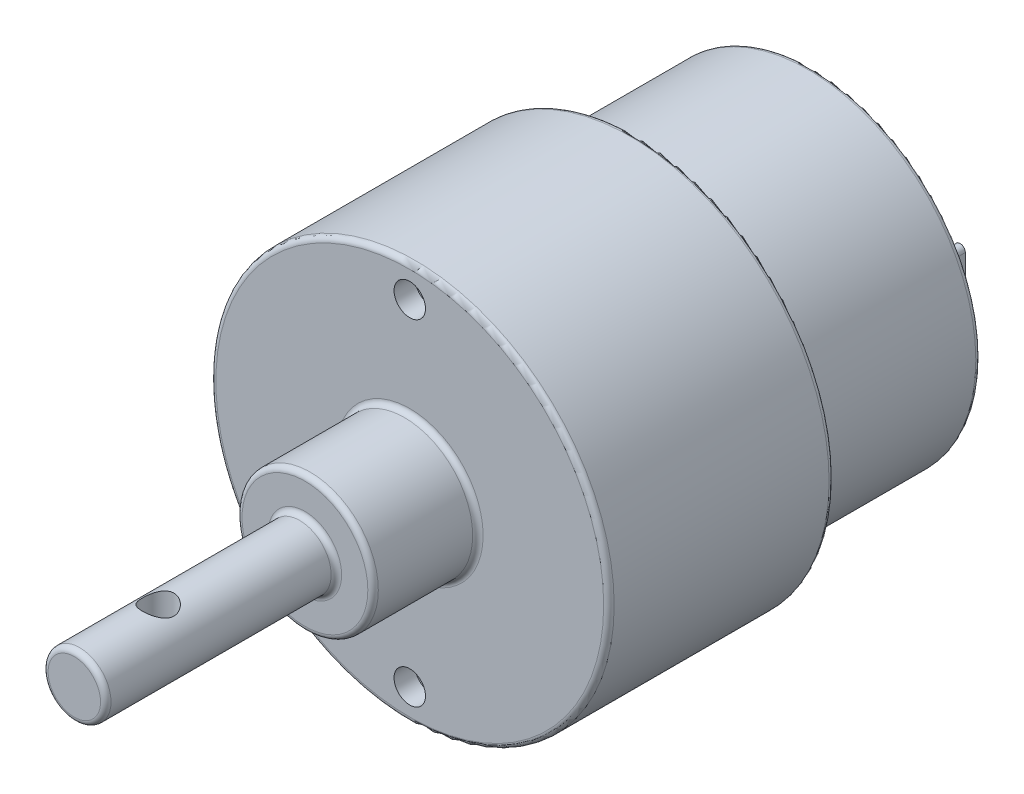
ISO-10303-21;
HEADER;
FILE_DESCRIPTION(('STEP AP214'),'2;1');
FILE_NAME('part.step','',(''),(''),'','','');
FILE_SCHEMA(('AUTOMOTIVE_DESIGN { 1 0 10303 214 1 1 1 1 }'));
ENDSEC;
DATA;
#1=APPLICATION_CONTEXT('core data for automotive mechanical design processes');
#2=APPLICATION_PROTOCOL_DEFINITION('international standard','automotive_design',2000,#1);
#3=PRODUCT_CONTEXT('',#1,'mechanical');
#4=PRODUCT('Part','Part','',(#3));
#5=PRODUCT_RELATED_PRODUCT_CATEGORY('part','',(#4));
#6=PRODUCT_DEFINITION_FORMATION('','',#4);
#7=PRODUCT_DEFINITION_CONTEXT('part definition',#1,'design');
#8=PRODUCT_DEFINITION('design','',#6,#7);
#9=PRODUCT_DEFINITION_SHAPE('','',#8);
#10=(LENGTH_UNIT() NAMED_UNIT(*) SI_UNIT(.MILLI.,.METRE.));
#11=(NAMED_UNIT(*) PLANE_ANGLE_UNIT() SI_UNIT($,.RADIAN.));
#12=(NAMED_UNIT(*) SI_UNIT($,.STERADIAN.) SOLID_ANGLE_UNIT());
#13=UNCERTAINTY_MEASURE_WITH_UNIT(LENGTH_MEASURE(1.E-05),#10,'distance_accuracy_value','');
#14=(GEOMETRIC_REPRESENTATION_CONTEXT(3) GLOBAL_UNCERTAINTY_ASSIGNED_CONTEXT((#13)) GLOBAL_UNIT_ASSIGNED_CONTEXT((#10,
#11,#12)) REPRESENTATION_CONTEXT('',''));
#15=CARTESIAN_POINT('',(0.,0.,0.));
#16=DIRECTION('',(0.,0.,1.));
#17=DIRECTION('',(1.,0.,0.));
#18=AXIS2_PLACEMENT_3D('',#15,#16,#17);
#19=CARTESIAN_POINT('',(0.,15.5,-16.9390243902439));
#20=DIRECTION('',(0.,0.,1.));
#21=DIRECTION('',(1.,0.,0.));
#22=AXIS2_PLACEMENT_3D('',#19,#20,#21);
#23=PLANE('',#22);
#24=CARTESIAN_POINT('',(8.,1.88457824065886,-16.9390243902439));
#25=DIRECTION('',(0.,0.,-1.));
#26=DIRECTION('',(-1.,0.,0.));
#27=AXIS2_PLACEMENT_3D('',#24,#25,#26);
#28=CIRCLE('',#27,0.5);
#29=CARTESIAN_POINT('',(7.5,1.88457824065886,-16.9390243902439));
#30=VERTEX_POINT('',#29);
#31=CARTESIAN_POINT('',(8.5,1.88457824065886,-16.9390243902439));
#32=VERTEX_POINT('',#31);
#33=EDGE_CURVE('E134',#30,#32,#28,.T.);
#34=ORIENTED_EDGE('',*,*,#33,.F.);
#35=DIRECTION('',(0.,1.,0.));
#36=VECTOR('',#35,1.);
#37=CARTESIAN_POINT('',(7.5,1.88457824065886,-16.9390243902439));
#38=LINE('',#37,#36);
#39=CARTESIAN_POINT('',(7.5,-1.42304887559912,-16.9390243902439));
#40=VERTEX_POINT('',#39);
#41=EDGE_CURVE('E147',#40,#30,#38,.T.);
#42=ORIENTED_EDGE('',*,*,#41,.F.);
#43=CARTESIAN_POINT('',(8.,-1.42304887559912,-16.9390243902439));
#44=DIRECTION('',(0.,0.,-1.));
#45=DIRECTION('',(-1.,0.,0.));
#46=AXIS2_PLACEMENT_3D('',#43,#44,#45);
#47=CIRCLE('',#46,0.5);
#48=CARTESIAN_POINT('',(8.5,-1.42304887559912,-16.9390243902439));
#49=VERTEX_POINT('',#48);
#50=EDGE_CURVE('E156',#49,#40,#47,.T.);
#51=ORIENTED_EDGE('',*,*,#50,.F.);
#52=DIRECTION('',(0.,-1.,0.));
#53=VECTOR('',#52,1.);
#54=CARTESIAN_POINT('',(8.5,1.88457824065886,-16.9390243902439));
#55=LINE('',#54,#53);
#56=EDGE_CURVE('E137',#32,#49,#55,.T.);
#57=ORIENTED_EDGE('',*,*,#56,.F.);
#58=EDGE_LOOP('',(#34,#42,#51,#57));
#59=FACE_BOUND('',#58,.T.);
#60=CARTESIAN_POINT('',(0.,0.,-16.9390243902439));
#61=DIRECTION('',(0.,0.,1.));
#62=DIRECTION('',(1.,0.,0.));
#63=AXIS2_PLACEMENT_3D('',#60,#61,#62);
#64=CIRCLE('',#63,15.5);
#65=CARTESIAN_POINT('',(15.5,0.,-16.9390243902439));
#66=VERTEX_POINT('',#65);
#67=EDGE_CURVE('E173',#66,#66,#64,.T.);
#68=ORIENTED_EDGE('',*,*,#67,.F.);
#69=EDGE_LOOP('',(#68));
#70=FACE_BOUND('',#69,.T.);
#71=CARTESIAN_POINT('',(-8.,1.88457824065887,-16.9390243902439));
#72=DIRECTION('',(0.,0.,-1.));
#73=DIRECTION('',(-1.,0.,0.));
#74=AXIS2_PLACEMENT_3D('',#71,#72,#73);
#75=CIRCLE('',#74,0.5);
#76=CARTESIAN_POINT('',(-8.5,1.88457824065887,-16.9390243902439));
#77=VERTEX_POINT('',#76);
#78=CARTESIAN_POINT('',(-7.5,1.88457824065887,-16.9390243902439));
#79=VERTEX_POINT('',#78);
#80=EDGE_CURVE('E133',#77,#79,#75,.T.);
#81=ORIENTED_EDGE('',*,*,#80,.F.);
#82=DIRECTION('',(0.,1.,0.));
#83=VECTOR('',#82,1.);
#84=CARTESIAN_POINT('',(-8.5,1.88457824065887,-16.9390243902439));
#85=LINE('',#84,#83);
#86=CARTESIAN_POINT('',(-8.5,-1.42304887559912,-16.9390243902439));
#87=VERTEX_POINT('',#86);
#88=EDGE_CURVE('E130',#87,#77,#85,.T.);
#89=ORIENTED_EDGE('',*,*,#88,.F.);
#90=CARTESIAN_POINT('',(-8.,-1.42304887559912,-16.9390243902439));
#91=DIRECTION('',(0.,0.,-1.));
#92=DIRECTION('',(-1.,0.,0.));
#93=AXIS2_PLACEMENT_3D('',#90,#91,#92);
#94=CIRCLE('',#93,0.5);
#95=CARTESIAN_POINT('',(-7.5,-1.42304887559912,-16.9390243902439));
#96=VERTEX_POINT('',#95);
#97=EDGE_CURVE('E68',#96,#87,#94,.T.);
#98=ORIENTED_EDGE('',*,*,#97,.F.);
#99=DIRECTION('',(0.,-1.,0.));
#100=VECTOR('',#99,1.);
#101=CARTESIAN_POINT('',(-7.5,1.88457824065887,-16.9390243902439));
#102=LINE('',#101,#100);
#103=EDGE_CURVE('E63',#79,#96,#102,.T.);
#104=ORIENTED_EDGE('',*,*,#103,.F.);
#105=EDGE_LOOP('',(#81,#89,#98,#104));
#106=FACE_BOUND('',#105,.T.);
#107=ADVANCED_FACE('F41',(#59,#70,#106),#23,.F.);
#108=CARTESIAN_POINT('',(0.,0.,53.5609756097561));
#109=DIRECTION('',(0.,0.,-1.));
#110=DIRECTION('',(-1.,0.,0.));
#111=AXIS2_PLACEMENT_3D('',#108,#109,#110);
#112=PLANE('',#111);
#113=CARTESIAN_POINT('',(0.,0.,53.5609756097561));
#114=DIRECTION('',(0.,0.,1.));
#115=DIRECTION('',(1.,0.,0.));
#116=AXIS2_PLACEMENT_3D('',#113,#114,#115);
#117=CIRCLE('',#116,2.5);
#118=CARTESIAN_POINT('',(2.5,0.,53.5609756097561));
#119=VERTEX_POINT('',#118);
#120=EDGE_CURVE('E11',#119,#119,#117,.T.);
#121=ORIENTED_EDGE('',*,*,#120,.T.);
#122=EDGE_LOOP('',(#121));
#123=FACE_BOUND('',#122,.T.);
#124=ADVANCED_FACE('F43',(#123),#112,.F.);
#125=CARTESIAN_POINT('',(0.,0.,53.0609756097561));
#126=DIRECTION('',(0.,0.,1.));
#127=DIRECTION('',(1.,0.,0.));
#128=AXIS2_PLACEMENT_3D('',#125,#126,#127);
#129=TOROIDAL_SURFACE('',#128,2.5,0.5);
#130=ORIENTED_EDGE('',*,*,#120,.F.);
#131=EDGE_LOOP('',(#130));
#132=FACE_BOUND('',#131,.T.);
#133=CARTESIAN_POINT('',(0.,0.,53.0609756097561));
#134=DIRECTION('',(0.,0.,1.));
#135=DIRECTION('',(1.,0.,0.));
#136=AXIS2_PLACEMENT_3D('',#133,#134,#135);
#137=CIRCLE('',#136,3.);
#138=CARTESIAN_POINT('',(3.,0.,53.0609756097561));
#139=VERTEX_POINT('',#138);
#140=EDGE_CURVE('E55',#139,#139,#137,.T.);
#141=ORIENTED_EDGE('',*,*,#140,.T.);
#142=EDGE_LOOP('',(#141));
#143=FACE_BOUND('',#142,.T.);
#144=ADVANCED_FACE('F288',(#132,#143),#129,.T.);
#145=CARTESIAN_POINT('',(0.,0.,60.1463414634146));
#146=DIRECTION('',(0.,0.,1.));
#147=DIRECTION('',(1.,0.,0.));
#148=AXIS2_PLACEMENT_3D('',#145,#146,#147);
#149=CYLINDRICAL_SURFACE('',#148,3.);
#150=CARTESIAN_POINT('',(0.,-3.,47.0609756097561));
#151=CARTESIAN_POINT('',(0.07885794442685,-2.99999570107562,47.0609706562803));
#152=CARTESIAN_POINT('',(0.157809899546344,-2.99685736529635,47.0547205000745));
#153=CARTESIAN_POINT('',(0.313380352903344,-2.98461234055736,47.0299962892438));
#154=CARTESIAN_POINT('',(0.389994130070444,-2.97549431743379,47.0114990202594));
#155=CARTESIAN_POINT('',(0.538400317320675,-2.95224419105063,46.9631848968312));
#156=CARTESIAN_POINT('',(0.610210204408723,-2.93813158766306,46.9334120333841));
#157=CARTESIAN_POINT('',(0.747708925209902,-2.90618664773642,46.8636196777086));
#158=CARTESIAN_POINT('',(0.81339824098509,-2.88835460450288,46.8236009933828));
#159=CARTESIAN_POINT('',(0.941261726642864,-2.84934387387093,46.7316997355282));
#160=CARTESIAN_POINT('',(1.00298281668316,-2.82802798691306,46.6792458908966));
#161=CARTESIAN_POINT('',(1.11716916730047,-2.78489955370114,46.5651933908855));
#162=CARTESIAN_POINT('',(1.16962737466015,-2.76308664313552,46.5035878320974));
#163=CARTESIAN_POINT('',(1.26787800067542,-2.71948426796021,46.367250585471));
#164=CARTESIAN_POINT('',(1.31283800332746,-2.69782780455198,46.2918714622372));
#165=CARTESIAN_POINT('',(1.38925234033604,-2.65928968158481,46.1334246057768));
#166=CARTESIAN_POINT('',(1.4207163224495,-2.64240461410484,46.050362416672));
#167=CARTESIAN_POINT('',(1.46719866328288,-2.61686800556713,45.8839779516232));
#168=CARTESIAN_POINT('',(1.48308878562066,-2.6077840737557,45.800968931655));
#169=CARTESIAN_POINT('',(1.50064048996327,-2.59772834922792,45.6330073530869));
#170=CARTESIAN_POINT('',(1.50231613255961,-2.59674854014932,45.5480567984494));
#171=CARTESIAN_POINT('',(1.49203093075844,-2.60266395385873,45.389546573283));
#172=CARTESIAN_POINT('',(1.48167683930523,-2.6086314549302,45.3158395629215));
#173=CARTESIAN_POINT('',(1.4504097735854,-2.62614343100776,45.1713927456965));
#174=CARTESIAN_POINT('',(1.42949343584648,-2.63768968247664,45.1006538917981));
#175=CARTESIAN_POINT('',(1.377314670579,-2.66531214619112,44.9621319109076));
#176=CARTESIAN_POINT('',(1.34582260067399,-2.68148760995998,44.8944560115774));
#177=CARTESIAN_POINT('',(1.273562531502,-2.71655106422106,44.7650241708711));
#178=CARTESIAN_POINT('',(1.2327903657187,-2.73544027170286,44.703270906356));
#179=CARTESIAN_POINT('',(1.13709908236918,-2.77669736854929,44.5791937306413));
#180=CARTESIAN_POINT('',(1.08104168755392,-2.79920265355119,44.5177902993919));
#181=CARTESIAN_POINT('',(0.959333368112059,-2.84321434950611,44.4048724818697));
#182=CARTESIAN_POINT('',(0.893677884861427,-2.86472027938201,44.3533628217053));
#183=CARTESIAN_POINT('',(0.750774758747773,-2.90552980924446,44.2594471182115));
#184=CARTESIAN_POINT('',(0.673130387399113,-2.92468476243011,44.2175749010875));
#185=CARTESIAN_POINT('',(0.510699323233194,-2.95736821681863,44.1478300661916));
#186=CARTESIAN_POINT('',(0.425918364397912,-2.9709011841533,44.1199463322333));
#187=CARTESIAN_POINT('',(0.259149737491051,-2.98986500612153,44.0812625041811));
#188=CARTESIAN_POINT('',(0.177512295822487,-2.99587407451965,44.0692387561359));
#189=CARTESIAN_POINT('',(0.0131693999240249,-3.00109520188655,44.0587785130544));
#190=CARTESIAN_POINT('',(-0.0695355298048654,-3.00031048081978,44.0603355812969));
#191=CARTESIAN_POINT('',(-0.226849457978981,-2.99236788380152,44.0762856423842));
#192=CARTESIAN_POINT('',(-0.301589112074895,-2.98570868532252,44.0896744088511));
#193=CARTESIAN_POINT('',(-0.447610338452911,-2.9673325697226,44.1273327175988));
#194=CARTESIAN_POINT('',(-0.518891528536631,-2.95561509501618,44.1516034594363));
#195=CARTESIAN_POINT('',(-0.658332912674359,-2.92776377120382,44.2109733094056));
#196=CARTESIAN_POINT('',(-0.726345595508704,-2.91151322654446,44.2463621849305));
#197=CARTESIAN_POINT('',(-0.855692042548907,-2.87615961476126,44.3266369132259));
#198=CARTESIAN_POINT('',(-0.917022944664888,-2.85705533350407,44.3715268116492));
#199=CARTESIAN_POINT('',(-1.03765153393382,-2.81562332004297,44.4746162477522));
#200=CARTESIAN_POINT('',(-1.09615811672854,-2.79316327265249,44.5336899124238));
#201=CARTESIAN_POINT('',(-1.20278448167828,-2.7489358741323,44.6608633366727));
#202=CARTESIAN_POINT('',(-1.25089707856781,-2.72716901100071,44.728969288028));
#203=CARTESIAN_POINT('',(-1.33756187171853,-2.68576788309734,44.8764410910156));
#204=CARTESIAN_POINT('',(-1.37553824370037,-2.66628794383591,44.9561925088978));
#205=CARTESIAN_POINT('',(-1.43712423890206,-2.63361108441202,45.1222407111186));
#206=CARTESIAN_POINT('',(-1.46075237380052,-2.62040607332625,45.2085288994564));
#207=CARTESIAN_POINT('',(-1.49079253120031,-2.60342251538703,45.3763409440832));
#208=CARTESIAN_POINT('',(-1.49863949460818,-2.59886075197597,45.457526989909));
#209=CARTESIAN_POINT('',(-1.5010337315643,-2.59748031962405,45.6201462105029));
#210=CARTESIAN_POINT('',(-1.49558676993486,-2.60065829439585,45.7015792628629));
#211=CARTESIAN_POINT('',(-1.47288918838996,-2.61356793076615,45.8542008620563));
#212=CARTESIAN_POINT('',(-1.45681247151455,-2.62264641723988,45.9256263149732));
#213=CARTESIAN_POINT('',(-1.41476303733661,-2.64556524281479,46.0646877888926));
#214=CARTESIAN_POINT('',(-1.38878713673988,-2.65940711354503,46.1323225828941));
#215=CARTESIAN_POINT('',(-1.32572361795084,-2.69142795546804,46.2669128862359));
#216=CARTESIAN_POINT('',(-1.28800670672355,-2.70983583593881,46.3335174624996));
#217=CARTESIAN_POINT('',(-1.20322645745609,-2.74852997452291,46.459887414028));
#218=CARTESIAN_POINT('',(-1.15615825686234,-2.76881720693416,46.5196492055378));
#219=CARTESIAN_POINT('',(-1.04730498999206,-2.81193484737138,46.6381885832881));
#220=CARTESIAN_POINT('',(-0.984426634495893,-2.83477474959942,46.6959642632815));
#221=CARTESIAN_POINT('',(-0.849232209349796,-2.87816628389896,46.800370084909));
#222=CARTESIAN_POINT('',(-0.776911084957797,-2.89871667939293,46.846994218961));
#223=CARTESIAN_POINT('',(-0.623897395174419,-2.93547014349806,46.9278301538242));
#224=CARTESIAN_POINT('',(-0.543149255665095,-2.95164144740899,46.9619518636108));
#225=CARTESIAN_POINT('',(-0.376113151707129,-2.9775201194848,47.0156878613922));
#226=CARTESIAN_POINT('',(-0.28984169938365,-2.98724585044602,47.0353433799647));
#227=CARTESIAN_POINT('',(-0.168902919736344,-2.99543192870217,47.0518217263847));
#228=CARTESIAN_POINT('',(-0.135242819162348,-2.99714048010376,47.0552495710556));
#229=CARTESIAN_POINT('',(-0.0677275977076382,-2.99942545465223,47.0598276080272));
#230=CARTESIAN_POINT('',(-0.0338724714699431,-3.00000184655071,47.0609777374614));
#231=CARTESIAN_POINT('',(0.,-3.,47.0609756097561));
#232=B_SPLINE_CURVE_WITH_KNOTS('',3,(#150,#151,#152,#153,#154,#155,#156,#157,#158,#159,#160,
#161,#162,#163,#164,#165,#166,#167,#168,#169,#170,#171,#172,#173,#174,#175,#176,#177,#178,#179,
#180,#181,#182,#183,#184,#185,#186,#187,#188,#189,#190,#191,#192,#193,#194,#195,#196,#197,#198,
#199,#200,#201,#202,#203,#204,#205,#206,#207,#208,#209,#210,#211,#212,#213,#214,#215,#216,#217,
#218,#219,#220,#221,#222,#223,#224,#225,#226,#227,#228,#229,#230,#231),.UNSPECIFIED.,.T.,.F.,(4,
2,2,2,2,2,2,2,2,2,2,2,2,2,2,2,2,2,2,2,2,2,2,2,2,2,2,2,2,2,2,2,2,2,2,2,2,2,2,2,4),(0.,
0.236436386130438,0.473322224563798,0.709293233238452,0.945245640872352,1.19547263807713,
1.44588935648105,1.71572589646129,1.98536921847422,2.23887018210345,2.49212035993531,
2.71508568613982,2.93812205888519,3.16635360252732,3.39468781890333,3.65197412000818,
3.9093830189803,4.17874533321661,4.4478932536842,4.69474935707019,4.94148846767214,
5.16910359759183,5.39674382446397,5.63089284041848,5.86514176122509,6.12239415966628,
6.37982382923148,6.64972023242589,6.91926767918176,7.16293961254569,7.40650589797017,
7.62686895373284,7.84730293182527,8.08254685170431,8.31791341715446,8.58187864135757,
8.84598575071868,9.1119602049529,9.37717362931724,9.47872920200875,9.58028757766599),.UNSPECIFIED.);
#233=CARTESIAN_POINT('',(0.,-3.,47.0609756097561));
#234=VERTEX_POINT('',#233);
#235=EDGE_CURVE('E45',#234,#234,#232,.T.);
#236=ORIENTED_EDGE('',*,*,#235,.T.);
#237=EDGE_LOOP('',(#236));
#238=FACE_BOUND('',#237,.T.);
#239=CARTESIAN_POINT('',(0.,3.,47.0609756097561));
#240=CARTESIAN_POINT('',(-0.07885794442685,2.99999570107562,47.0609706562803));
#241=CARTESIAN_POINT('',(-0.157809899546344,2.99685736529635,47.0547205000745));
#242=CARTESIAN_POINT('',(-0.313380352903344,2.98461234055736,47.0299962892438));
#243=CARTESIAN_POINT('',(-0.389994130070444,2.97549431743379,47.0114990202594));
#244=CARTESIAN_POINT('',(-0.538400317320675,2.95224419105063,46.9631848968312));
#245=CARTESIAN_POINT('',(-0.610210204408723,2.93813158766306,46.9334120333841));
#246=CARTESIAN_POINT('',(-0.747708925209902,2.90618664773642,46.8636196777086));
#247=CARTESIAN_POINT('',(-0.81339824098509,2.88835460450288,46.8236009933828));
#248=CARTESIAN_POINT('',(-0.941261726642864,2.84934387387093,46.7316997355282));
#249=CARTESIAN_POINT('',(-1.00298281668316,2.82802798691306,46.6792458908966));
#250=CARTESIAN_POINT('',(-1.11716916730047,2.78489955370114,46.5651933908855));
#251=CARTESIAN_POINT('',(-1.16962737466015,2.76308664313552,46.5035878320974));
#252=CARTESIAN_POINT('',(-1.26787800067542,2.71948426796021,46.367250585471));
#253=CARTESIAN_POINT('',(-1.31283800332746,2.69782780455198,46.2918714622372));
#254=CARTESIAN_POINT('',(-1.38925234033604,2.65928968158481,46.1334246057768));
#255=CARTESIAN_POINT('',(-1.4207163224495,2.64240461410484,46.050362416672));
#256=CARTESIAN_POINT('',(-1.46719866328288,2.61686800556713,45.8839779516232));
#257=CARTESIAN_POINT('',(-1.48308878562066,2.6077840737557,45.800968931655));
#258=CARTESIAN_POINT('',(-1.50064048996327,2.59772834922792,45.6330073530869));
#259=CARTESIAN_POINT('',(-1.50231613255961,2.59674854014932,45.5480567984494));
#260=CARTESIAN_POINT('',(-1.49203093075844,2.60266395385873,45.389546573283));
#261=CARTESIAN_POINT('',(-1.48167683930523,2.6086314549302,45.3158395629215));
#262=CARTESIAN_POINT('',(-1.4504097735854,2.62614343100776,45.1713927456965));
#263=CARTESIAN_POINT('',(-1.42949343584648,2.63768968247664,45.1006538917981));
#264=CARTESIAN_POINT('',(-1.377314670579,2.66531214619112,44.9621319109076));
#265=CARTESIAN_POINT('',(-1.34582260067399,2.68148760995998,44.8944560115774));
#266=CARTESIAN_POINT('',(-1.273562531502,2.71655106422106,44.7650241708711));
#267=CARTESIAN_POINT('',(-1.2327903657187,2.73544027170286,44.703270906356));
#268=CARTESIAN_POINT('',(-1.13709908236918,2.77669736854929,44.5791937306413));
#269=CARTESIAN_POINT('',(-1.08104168755392,2.79920265355119,44.5177902993919));
#270=CARTESIAN_POINT('',(-0.959333368112059,2.84321434950611,44.4048724818697));
#271=CARTESIAN_POINT('',(-0.893677884861427,2.86472027938201,44.3533628217053));
#272=CARTESIAN_POINT('',(-0.750774758747773,2.90552980924446,44.2594471182115));
#273=CARTESIAN_POINT('',(-0.673130387399113,2.92468476243011,44.2175749010875));
#274=CARTESIAN_POINT('',(-0.510699323233194,2.95736821681863,44.1478300661916));
#275=CARTESIAN_POINT('',(-0.425918364397912,2.9709011841533,44.1199463322333));
#276=CARTESIAN_POINT('',(-0.259149737491051,2.98986500612153,44.0812625041811));
#277=CARTESIAN_POINT('',(-0.177512295822487,2.99587407451965,44.0692387561359));
#278=CARTESIAN_POINT('',(-0.0131693999240249,3.00109520188655,44.0587785130544));
#279=CARTESIAN_POINT('',(0.0695355298048654,3.00031048081978,44.0603355812969));
#280=CARTESIAN_POINT('',(0.226849457978981,2.99236788380152,44.0762856423842));
#281=CARTESIAN_POINT('',(0.301589112074895,2.98570868532252,44.0896744088511));
#282=CARTESIAN_POINT('',(0.447610338452911,2.9673325697226,44.1273327175988));
#283=CARTESIAN_POINT('',(0.518891528536631,2.95561509501618,44.1516034594363));
#284=CARTESIAN_POINT('',(0.658332912674359,2.92776377120382,44.2109733094056));
#285=CARTESIAN_POINT('',(0.726345595508704,2.91151322654446,44.2463621849305));
#286=CARTESIAN_POINT('',(0.855692042548907,2.87615961476126,44.3266369132259));
#287=CARTESIAN_POINT('',(0.917022944664888,2.85705533350407,44.3715268116492));
#288=CARTESIAN_POINT('',(1.03765153393382,2.81562332004297,44.4746162477522));
#289=CARTESIAN_POINT('',(1.09615811672854,2.79316327265249,44.5336899124238));
#290=CARTESIAN_POINT('',(1.20278448167828,2.7489358741323,44.6608633366727));
#291=CARTESIAN_POINT('',(1.25089707856781,2.72716901100071,44.728969288028));
#292=CARTESIAN_POINT('',(1.33756187171853,2.68576788309734,44.8764410910156));
#293=CARTESIAN_POINT('',(1.37553824370037,2.66628794383591,44.9561925088978));
#294=CARTESIAN_POINT('',(1.43712423890206,2.63361108441202,45.1222407111186));
#295=CARTESIAN_POINT('',(1.46075237380052,2.62040607332625,45.2085288994564));
#296=CARTESIAN_POINT('',(1.49079253120031,2.60342251538703,45.3763409440832));
#297=CARTESIAN_POINT('',(1.49863949460818,2.59886075197597,45.457526989909));
#298=CARTESIAN_POINT('',(1.5010337315643,2.59748031962405,45.6201462105029));
#299=CARTESIAN_POINT('',(1.49558676993486,2.60065829439585,45.7015792628629));
#300=CARTESIAN_POINT('',(1.47288918838996,2.61356793076615,45.8542008620563));
#301=CARTESIAN_POINT('',(1.45681247151455,2.62264641723988,45.9256263149732));
#302=CARTESIAN_POINT('',(1.41476303733661,2.64556524281479,46.0646877888926));
#303=CARTESIAN_POINT('',(1.38878713673988,2.65940711354503,46.1323225828941));
#304=CARTESIAN_POINT('',(1.32572361795084,2.69142795546804,46.2669128862359));
#305=CARTESIAN_POINT('',(1.28800670672355,2.70983583593881,46.3335174624996));
#306=CARTESIAN_POINT('',(1.20322645745609,2.74852997452291,46.459887414028));
#307=CARTESIAN_POINT('',(1.15615825686234,2.76881720693416,46.5196492055378));
#308=CARTESIAN_POINT('',(1.04730498999206,2.81193484737138,46.6381885832881));
#309=CARTESIAN_POINT('',(0.984426634495893,2.83477474959942,46.6959642632815));
#310=CARTESIAN_POINT('',(0.849232209349796,2.87816628389896,46.800370084909));
#311=CARTESIAN_POINT('',(0.776911084957797,2.89871667939293,46.846994218961));
#312=CARTESIAN_POINT('',(0.623897395174419,2.93547014349806,46.9278301538242));
#313=CARTESIAN_POINT('',(0.543149255665095,2.95164144740899,46.9619518636108));
#314=CARTESIAN_POINT('',(0.376113151707129,2.9775201194848,47.0156878613922));
#315=CARTESIAN_POINT('',(0.28984169938365,2.98724585044602,47.0353433799647));
#316=CARTESIAN_POINT('',(0.168902919736344,2.99543192870217,47.0518217263847));
#317=CARTESIAN_POINT('',(0.135242819162348,2.99714048010376,47.0552495710556));
#318=CARTESIAN_POINT('',(0.0677275977076382,2.99942545465223,47.0598276080272));
#319=CARTESIAN_POINT('',(0.0338724714699431,3.00000184655071,47.0609777374614));
#320=CARTESIAN_POINT('',(0.,3.,47.0609756097561));
#321=B_SPLINE_CURVE_WITH_KNOTS('',3,(#239,#240,#241,#242,#243,#244,#245,#246,#247,#248,#249,
#250,#251,#252,#253,#254,#255,#256,#257,#258,#259,#260,#261,#262,#263,#264,#265,#266,#267,#268,
#269,#270,#271,#272,#273,#274,#275,#276,#277,#278,#279,#280,#281,#282,#283,#284,#285,#286,#287,
#288,#289,#290,#291,#292,#293,#294,#295,#296,#297,#298,#299,#300,#301,#302,#303,#304,#305,#306,
#307,#308,#309,#310,#311,#312,#313,#314,#315,#316,#317,#318,#319,#320),.UNSPECIFIED.,.T.,.F.,(4,
2,2,2,2,2,2,2,2,2,2,2,2,2,2,2,2,2,2,2,2,2,2,2,2,2,2,2,2,2,2,2,2,2,2,2,2,2,2,2,4),(0.,
0.236436386130438,0.473322224563798,0.709293233238452,0.945245640872352,1.19547263807713,
1.44588935648105,1.71572589646129,1.98536921847422,2.23887018210345,2.49212035993531,
2.71508568613982,2.93812205888519,3.16635360252732,3.39468781890333,3.65197412000818,
3.9093830189803,4.17874533321661,4.4478932536842,4.69474935707019,4.94148846767214,
5.16910359759183,5.39674382446397,5.63089284041848,5.86514176122509,6.12239415966628,
6.37982382923148,6.64972023242589,6.91926767918176,7.16293961254569,7.40650589797017,
7.62686895373284,7.84730293182527,8.08254685170431,8.31791341715446,8.58187864135757,
8.84598575071868,9.1119602049529,9.37717362931724,9.47872920200875,9.58028757766599),.UNSPECIFIED.);
#322=CARTESIAN_POINT('',(0.,3.,47.0609756097561));
#323=VERTEX_POINT('',#322);
#324=EDGE_CURVE('E172',#323,#323,#321,.T.);
#325=ORIENTED_EDGE('',*,*,#324,.T.);
#326=EDGE_LOOP('',(#325));
#327=FACE_BOUND('',#326,.T.);
#328=ORIENTED_EDGE('',*,*,#140,.F.);
#329=EDGE_LOOP('',(#328));
#330=FACE_BOUND('',#329,.T.);
#331=CARTESIAN_POINT('',(0.,0.,32.0609756097561));
#332=DIRECTION('',(0.,0.,1.));
#333=DIRECTION('',(1.,0.,0.));
#334=AXIS2_PLACEMENT_3D('',#331,#332,#333);
#335=CIRCLE('',#334,3.);
#336=CARTESIAN_POINT('',(3.,0.,32.0609756097561));
#337=VERTEX_POINT('',#336);
#338=EDGE_CURVE('E212',#337,#337,#335,.T.);
#339=ORIENTED_EDGE('',*,*,#338,.T.);
#340=EDGE_LOOP('',(#339));
#341=FACE_BOUND('',#340,.T.);
#342=ADVANCED_FACE('F220',(#238,#327,#330,#341),#149,.T.);
#343=CARTESIAN_POINT('',(0.,0.,32.0609756097561));
#344=DIRECTION('',(0.,0.,1.));
#345=DIRECTION('',(1.,0.,0.));
#346=AXIS2_PLACEMENT_3D('',#343,#344,#345);
#347=TOROIDAL_SURFACE('',#346,3.5,0.5);
#348=ORIENTED_EDGE('',*,*,#338,.F.);
#349=EDGE_LOOP('',(#348));
#350=FACE_BOUND('',#349,.T.);
#351=CARTESIAN_POINT('',(0.,0.,31.5609756097561));
#352=DIRECTION('',(0.,0.,1.));
#353=DIRECTION('',(1.,0.,0.));
#354=AXIS2_PLACEMENT_3D('',#351,#352,#353);
#355=CIRCLE('',#354,3.5);
#356=CARTESIAN_POINT('',(3.5,0.,31.5609756097561));
#357=VERTEX_POINT('',#356);
#358=EDGE_CURVE('E209',#357,#357,#355,.T.);
#359=ORIENTED_EDGE('',*,*,#358,.T.);
#360=EDGE_LOOP('',(#359));
#361=FACE_BOUND('',#360,.T.);
#362=ADVANCED_FACE('F281',(#350,#361),#347,.F.);
#363=CARTESIAN_POINT('',(0.,3.5,31.5609756097561));
#364=DIRECTION('',(0.,0.,-1.));
#365=DIRECTION('',(-1.,0.,0.));
#366=AXIS2_PLACEMENT_3D('',#363,#364,#365);
#367=PLANE('',#366);
#368=ORIENTED_EDGE('',*,*,#358,.F.);
#369=EDGE_LOOP('',(#368));
#370=FACE_BOUND('',#369,.T.);
#371=CARTESIAN_POINT('',(0.,0.,31.5609756097561));
#372=DIRECTION('',(0.,0.,1.));
#373=DIRECTION('',(1.,0.,0.));
#374=AXIS2_PLACEMENT_3D('',#371,#372,#373);
#375=CIRCLE('',#374,6.);
#376=CARTESIAN_POINT('',(6.,0.,31.5609756097561));
#377=VERTEX_POINT('',#376);
#378=EDGE_CURVE('E206',#377,#377,#375,.T.);
#379=ORIENTED_EDGE('',*,*,#378,.T.);
#380=EDGE_LOOP('',(#379));
#381=FACE_BOUND('',#380,.T.);
#382=ADVANCED_FACE('F278',(#370,#381),#367,.F.);
#383=CARTESIAN_POINT('',(0.,0.,31.0609756097561));
#384=DIRECTION('',(0.,0.,1.));
#385=DIRECTION('',(1.,0.,0.));
#386=AXIS2_PLACEMENT_3D('',#383,#384,#385);
#387=TOROIDAL_SURFACE('',#386,6.,0.5);
#388=ORIENTED_EDGE('',*,*,#378,.F.);
#389=EDGE_LOOP('',(#388));
#390=FACE_BOUND('',#389,.T.);
#391=CARTESIAN_POINT('',(0.,0.,31.0609756097561));
#392=DIRECTION('',(0.,0.,1.));
#393=DIRECTION('',(1.,0.,0.));
#394=AXIS2_PLACEMENT_3D('',#391,#392,#393);
#395=CIRCLE('',#394,6.5);
#396=CARTESIAN_POINT('',(6.5,0.,31.0609756097561));
#397=VERTEX_POINT('',#396);
#398=EDGE_CURVE('E203',#397,#397,#395,.T.);
#399=ORIENTED_EDGE('',*,*,#398,.T.);
#400=EDGE_LOOP('',(#399));
#401=FACE_BOUND('',#400,.T.);
#402=ADVANCED_FACE('F274',(#390,#401),#387,.T.);
#403=CARTESIAN_POINT('',(0.,0.,60.1463414634146));
#404=DIRECTION('',(0.,0.,1.));
#405=DIRECTION('',(1.,0.,0.));
#406=AXIS2_PLACEMENT_3D('',#403,#404,#405);
#407=CYLINDRICAL_SURFACE('',#406,6.5);
#408=ORIENTED_EDGE('',*,*,#398,.F.);
#409=EDGE_LOOP('',(#408));
#410=FACE_BOUND('',#409,.T.);
#411=CARTESIAN_POINT('',(0.,0.,22.0609756097561));
#412=DIRECTION('',(0.,0.,1.));
#413=DIRECTION('',(1.,0.,0.));
#414=AXIS2_PLACEMENT_3D('',#411,#412,#413);
#415=CIRCLE('',#414,6.5);
#416=CARTESIAN_POINT('',(6.5,0.,22.0609756097561));
#417=VERTEX_POINT('',#416);
#418=EDGE_CURVE('E200',#417,#417,#415,.T.);
#419=ORIENTED_EDGE('',*,*,#418,.T.);
#420=EDGE_LOOP('',(#419));
#421=FACE_BOUND('',#420,.T.);
#422=ADVANCED_FACE('F270',(#410,#421),#407,.T.);
#423=CARTESIAN_POINT('',(0.,0.,22.0609756097561));
#424=DIRECTION('',(0.,0.,1.));
#425=DIRECTION('',(1.,0.,0.));
#426=AXIS2_PLACEMENT_3D('',#423,#424,#425);
#427=TOROIDAL_SURFACE('',#426,7.,0.5);
#428=ORIENTED_EDGE('',*,*,#418,.F.);
#429=EDGE_LOOP('',(#428));
#430=FACE_BOUND('',#429,.T.);
#431=CARTESIAN_POINT('',(0.,0.,21.5609756097561));
#432=DIRECTION('',(0.,0.,1.));
#433=DIRECTION('',(1.,0.,0.));
#434=AXIS2_PLACEMENT_3D('',#431,#432,#433);
#435=CIRCLE('',#434,7.);
#436=CARTESIAN_POINT('',(7.,0.,21.5609756097561));
#437=VERTEX_POINT('',#436);
#438=EDGE_CURVE('E197',#437,#437,#435,.T.);
#439=ORIENTED_EDGE('',*,*,#438,.T.);
#440=EDGE_LOOP('',(#439));
#441=FACE_BOUND('',#440,.T.);
#442=ADVANCED_FACE('F266',(#430,#441),#427,.F.);
#443=CARTESIAN_POINT('',(0.,7.,21.5609756097561));
#444=DIRECTION('',(0.,0.,-1.));
#445=DIRECTION('',(-1.,0.,0.));
#446=AXIS2_PLACEMENT_3D('',#443,#444,#445);
#447=PLANE('',#446);
#448=CARTESIAN_POINT('',(0.,-16.,21.5609756097561));
#449=DIRECTION('',(0.,0.,1.));
#450=DIRECTION('',(1.,0.,0.));
#451=AXIS2_PLACEMENT_3D('',#448,#449,#450);
#452=CIRCLE('',#451,1.5);
#453=CARTESIAN_POINT('',(1.5,-16.,21.5609756097561));
#454=VERTEX_POINT('',#453);
#455=EDGE_CURVE('E340',#454,#454,#452,.T.);
#456=ORIENTED_EDGE('',*,*,#455,.F.);
#457=EDGE_LOOP('',(#456));
#458=FACE_BOUND('',#457,.T.);
#459=CARTESIAN_POINT('',(0.,16.,21.5609756097561));
#460=DIRECTION('',(0.,0.,1.));
#461=DIRECTION('',(1.,0.,0.));
#462=AXIS2_PLACEMENT_3D('',#459,#460,#461);
#463=CIRCLE('',#462,1.5);
#464=CARTESIAN_POINT('',(1.5,16.,21.5609756097561));
#465=VERTEX_POINT('',#464);
#466=EDGE_CURVE('E334',#465,#465,#463,.T.);
#467=ORIENTED_EDGE('',*,*,#466,.F.);
#468=EDGE_LOOP('',(#467));
#469=FACE_BOUND('',#468,.T.);
#470=ORIENTED_EDGE('',*,*,#438,.F.);
#471=EDGE_LOOP('',(#470));
#472=FACE_BOUND('',#471,.T.);
#473=CARTESIAN_POINT('',(0.,0.,21.5609756097561));
#474=DIRECTION('',(0.,0.,1.));
#475=DIRECTION('',(1.,0.,0.));
#476=AXIS2_PLACEMENT_3D('',#473,#474,#475);
#477=CIRCLE('',#476,18.5);
#478=CARTESIAN_POINT('',(18.5,0.,21.5609756097561));
#479=VERTEX_POINT('',#478);
#480=EDGE_CURVE('E194',#479,#479,#477,.T.);
#481=ORIENTED_EDGE('',*,*,#480,.T.);
#482=EDGE_LOOP('',(#481));
#483=FACE_BOUND('',#482,.T.);
#484=ADVANCED_FACE('F262',(#458,#469,#472,#483),#447,.F.);
#485=CARTESIAN_POINT('',(0.,0.,21.0609756097561));
#486=DIRECTION('',(0.,0.,1.));
#487=DIRECTION('',(1.,0.,0.));
#488=AXIS2_PLACEMENT_3D('',#485,#486,#487);
#489=TOROIDAL_SURFACE('',#488,18.5,0.5);
#490=ORIENTED_EDGE('',*,*,#480,.F.);
#491=EDGE_LOOP('',(#490));
#492=FACE_BOUND('',#491,.T.);
#493=CARTESIAN_POINT('',(0.,0.,21.0609756097561));
#494=DIRECTION('',(0.,0.,1.));
#495=DIRECTION('',(1.,0.,0.));
#496=AXIS2_PLACEMENT_3D('',#493,#494,#495);
#497=CIRCLE('',#496,19.);
#498=CARTESIAN_POINT('',(19.,0.,21.0609756097561));
#499=VERTEX_POINT('',#498);
#500=EDGE_CURVE('E191',#499,#499,#497,.T.);
#501=ORIENTED_EDGE('',*,*,#500,.T.);
#502=EDGE_LOOP('',(#501));
#503=FACE_BOUND('',#502,.T.);
#504=ADVANCED_FACE('F258',(#492,#503),#489,.T.);
#505=CARTESIAN_POINT('',(0.,0.,60.1463414634146));
#506=DIRECTION('',(0.,0.,1.));
#507=DIRECTION('',(1.,0.,0.));
#508=AXIS2_PLACEMENT_3D('',#505,#506,#507);
#509=CYLINDRICAL_SURFACE('',#508,19.);
#510=ORIENTED_EDGE('',*,*,#500,.F.);
#511=EDGE_LOOP('',(#510));
#512=FACE_BOUND('',#511,.T.);
#513=CARTESIAN_POINT('',(0.,0.,0.560975609756098));
#514=DIRECTION('',(0.,0.,1.));
#515=DIRECTION('',(1.,0.,0.));
#516=AXIS2_PLACEMENT_3D('',#513,#514,#515);
#517=CIRCLE('',#516,19.);
#518=CARTESIAN_POINT('',(19.,0.,0.560975609756098));
#519=VERTEX_POINT('',#518);
#520=EDGE_CURVE('E188',#519,#519,#517,.T.);
#521=ORIENTED_EDGE('',*,*,#520,.T.);
#522=EDGE_LOOP('',(#521));
#523=FACE_BOUND('',#522,.T.);
#524=ADVANCED_FACE('F254',(#512,#523),#509,.T.);
#525=CARTESIAN_POINT('',(0.,0.,0.560975609756098));
#526=DIRECTION('',(0.,0.,1.));
#527=DIRECTION('',(1.,0.,0.));
#528=AXIS2_PLACEMENT_3D('',#525,#526,#527);
#529=TOROIDAL_SURFACE('',#528,18.5,0.5);
#530=ORIENTED_EDGE('',*,*,#520,.F.);
#531=EDGE_LOOP('',(#530));
#532=FACE_BOUND('',#531,.T.);
#533=CARTESIAN_POINT('',(0.,0.,0.0609756097560976));
#534=DIRECTION('',(0.,0.,1.));
#535=DIRECTION('',(1.,0.,0.));
#536=AXIS2_PLACEMENT_3D('',#533,#534,#535);
#537=CIRCLE('',#536,18.5);
#538=CARTESIAN_POINT('',(18.5,0.,0.0609756097560976));
#539=VERTEX_POINT('',#538);
#540=EDGE_CURVE('E185',#539,#539,#537,.T.);
#541=ORIENTED_EDGE('',*,*,#540,.T.);
#542=EDGE_LOOP('',(#541));
#543=FACE_BOUND('',#542,.T.);
#544=ADVANCED_FACE('F250',(#532,#543),#529,.T.);
#545=CARTESIAN_POINT('',(0.,18.5,0.0609756097560979));
#546=DIRECTION('',(0.,0.,1.));
#547=DIRECTION('',(1.,0.,0.));
#548=AXIS2_PLACEMENT_3D('',#545,#546,#547);
#549=PLANE('',#548);
#550=ORIENTED_EDGE('',*,*,#540,.F.);
#551=EDGE_LOOP('',(#550));
#552=FACE_BOUND('',#551,.T.);
#553=CARTESIAN_POINT('',(0.,0.,0.0609756097560976));
#554=DIRECTION('',(0.,0.,1.));
#555=DIRECTION('',(1.,0.,0.));
#556=AXIS2_PLACEMENT_3D('',#553,#554,#555);
#557=CIRCLE('',#556,16.5);
#558=CARTESIAN_POINT('',(16.5,0.,0.0609756097560976));
#559=VERTEX_POINT('',#558);
#560=EDGE_CURVE('E182',#559,#559,#557,.T.);
#561=ORIENTED_EDGE('',*,*,#560,.T.);
#562=EDGE_LOOP('',(#561));
#563=FACE_BOUND('',#562,.T.);
#564=ADVANCED_FACE('F246',(#552,#563),#549,.F.);
#565=CARTESIAN_POINT('',(0.,0.,-0.439024390243902));
#566=DIRECTION('',(0.,0.,1.));
#567=DIRECTION('',(1.,0.,0.));
#568=AXIS2_PLACEMENT_3D('',#565,#566,#567);
#569=TOROIDAL_SURFACE('',#568,16.5,0.5);
#570=ORIENTED_EDGE('',*,*,#560,.F.);
#571=EDGE_LOOP('',(#570));
#572=FACE_BOUND('',#571,.T.);
#573=CARTESIAN_POINT('',(0.,0.,-0.439024390243903));
#574=DIRECTION('',(0.,0.,1.));
#575=DIRECTION('',(1.,0.,0.));
#576=AXIS2_PLACEMENT_3D('',#573,#574,#575);
#577=CIRCLE('',#576,16.);
#578=CARTESIAN_POINT('',(16.,0.,-0.439024390243903));
#579=VERTEX_POINT('',#578);
#580=EDGE_CURVE('E179',#579,#579,#577,.T.);
#581=ORIENTED_EDGE('',*,*,#580,.T.);
#582=EDGE_LOOP('',(#581));
#583=FACE_BOUND('',#582,.T.);
#584=ADVANCED_FACE('F242',(#572,#583),#569,.F.);
#585=CARTESIAN_POINT('',(0.,0.,60.1463414634146));
#586=DIRECTION('',(0.,0.,1.));
#587=DIRECTION('',(1.,0.,0.));
#588=AXIS2_PLACEMENT_3D('',#585,#586,#587);
#589=CYLINDRICAL_SURFACE('',#588,16.);
#590=ORIENTED_EDGE('',*,*,#580,.F.);
#591=EDGE_LOOP('',(#590));
#592=FACE_BOUND('',#591,.T.);
#593=CARTESIAN_POINT('',(0.,0.,-16.4390243902439));
#594=DIRECTION('',(0.,0.,1.));
#595=DIRECTION('',(1.,0.,0.));
#596=AXIS2_PLACEMENT_3D('',#593,#594,#595);
#597=CIRCLE('',#596,16.);
#598=CARTESIAN_POINT('',(16.,0.,-16.4390243902439));
#599=VERTEX_POINT('',#598);
#600=EDGE_CURVE('E176',#599,#599,#597,.T.);
#601=ORIENTED_EDGE('',*,*,#600,.T.);
#602=EDGE_LOOP('',(#601));
#603=FACE_BOUND('',#602,.T.);
#604=ADVANCED_FACE('F238',(#592,#603),#589,.T.);
#605=CARTESIAN_POINT('',(0.,0.,-16.4390243902439));
#606=DIRECTION('',(0.,0.,1.));
#607=DIRECTION('',(1.,0.,0.));
#608=AXIS2_PLACEMENT_3D('',#605,#606,#607);
#609=TOROIDAL_SURFACE('',#608,15.5,0.5);
#610=ORIENTED_EDGE('',*,*,#600,.F.);
#611=EDGE_LOOP('',(#610));
#612=FACE_BOUND('',#611,.T.);
#613=ORIENTED_EDGE('',*,*,#67,.T.);
#614=EDGE_LOOP('',(#613));
#615=FACE_BOUND('',#614,.T.);
#616=ADVANCED_FACE('F229',(#612,#615),#609,.T.);
#617=CARTESIAN_POINT('',(0.,-5.,45.5609756097561));
#618=DIRECTION('',(0.,1.,0.));
#619=DIRECTION('',(0.,0.,1.));
#620=AXIS2_PLACEMENT_3D('',#617,#618,#619);
#621=CYLINDRICAL_SURFACE('',#620,1.5);
#622=ORIENTED_EDGE('',*,*,#324,.F.);
#623=EDGE_LOOP('',(#622));
#624=FACE_BOUND('',#623,.T.);
#625=ORIENTED_EDGE('',*,*,#235,.F.);
#626=EDGE_LOOP('',(#625));
#627=FACE_BOUND('',#626,.T.);
#628=ADVANCED_FACE('F223',(#624,#627),#621,.F.);
#629=CARTESIAN_POINT('',(8.,1.88457824065886,-22.9390243902439));
#630=DIRECTION('',(0.,0.,1.));
#631=DIRECTION('',(1.,0.,0.));
#632=AXIS2_PLACEMENT_3D('',#629,#630,#631);
#633=CYLINDRICAL_SURFACE('',#632,0.5);
#634=ORIENTED_EDGE('',*,*,#33,.T.);
#635=DIRECTION('',(0.,0.,1.));
#636=VECTOR('',#635,1.);
#637=CARTESIAN_POINT('',(8.5,1.88457824065886,-22.9390243902439));
#638=LINE('',#637,#636);
#639=CARTESIAN_POINT('',(8.5,1.88457824065886,-22.9390243902439));
#640=VERTEX_POINT('',#639);
#641=EDGE_CURVE('E169',#640,#32,#638,.T.);
#642=ORIENTED_EDGE('',*,*,#641,.F.);
#643=CARTESIAN_POINT('',(8.,1.88457824065886,-22.9390243902439));
#644=DIRECTION('',(0.,0.,-1.));
#645=DIRECTION('',(-1.,0.,0.));
#646=AXIS2_PLACEMENT_3D('',#643,#644,#645);
#647=CIRCLE('',#646,0.5);
#648=CARTESIAN_POINT('',(7.5,1.88457824065886,-22.9390243902439));
#649=VERTEX_POINT('',#648);
#650=EDGE_CURVE('E143',#649,#640,#647,.T.);
#651=ORIENTED_EDGE('',*,*,#650,.F.);
#652=DIRECTION('',(0.,0.,1.));
#653=VECTOR('',#652,1.);
#654=CARTESIAN_POINT('',(7.5,1.88457824065886,-22.9390243902439));
#655=LINE('',#654,#653);
#656=EDGE_CURVE('E152',#649,#30,#655,.T.);
#657=ORIENTED_EDGE('',*,*,#656,.T.);
#658=EDGE_LOOP('',(#634,#642,#651,#657));
#659=FACE_BOUND('',#658,.T.);
#660=ADVANCED_FACE('F228',(#659),#633,.T.);
#661=CARTESIAN_POINT('',(8.5,1.88457824065886,-22.9390243902439));
#662=DIRECTION('',(-1.,0.,0.));
#663=DIRECTION('',(0.,0.,1.));
#664=AXIS2_PLACEMENT_3D('',#661,#662,#663);
#665=PLANE('',#664);
#666=ORIENTED_EDGE('',*,*,#56,.T.);
#667=DIRECTION('',(0.,0.,1.));
#668=VECTOR('',#667,1.);
#669=CARTESIAN_POINT('',(8.5,-1.42304887559912,-22.9390243902439));
#670=LINE('',#669,#668);
#671=CARTESIAN_POINT('',(8.5,-1.42304887559912,-22.9390243902439));
#672=VERTEX_POINT('',#671);
#673=EDGE_CURVE('E166',#672,#49,#670,.T.);
#674=ORIENTED_EDGE('',*,*,#673,.F.);
#675=DIRECTION('',(0.,-1.,0.));
#676=VECTOR('',#675,1.);
#677=CARTESIAN_POINT('',(8.5,1.88457824065886,-22.9390243902439));
#678=LINE('',#677,#676);
#679=EDGE_CURVE('E146',#640,#672,#678,.T.);
#680=ORIENTED_EDGE('',*,*,#679,.F.);
#681=ORIENTED_EDGE('',*,*,#641,.T.);
#682=EDGE_LOOP('',(#666,#674,#680,#681));
#683=FACE_BOUND('',#682,.T.);
#684=ADVANCED_FACE('F390',(#683),#665,.F.);
#685=CARTESIAN_POINT('',(8.,-1.42304887559912,-22.9390243902439));
#686=DIRECTION('',(0.,0.,1.));
#687=DIRECTION('',(1.,0.,0.));
#688=AXIS2_PLACEMENT_3D('',#685,#686,#687);
#689=CYLINDRICAL_SURFACE('',#688,0.5);
#690=ORIENTED_EDGE('',*,*,#50,.T.);
#691=DIRECTION('',(0.,0.,1.));
#692=VECTOR('',#691,1.);
#693=CARTESIAN_POINT('',(7.5,-1.42304887559912,-22.9390243902439));
#694=LINE('',#693,#692);
#695=CARTESIAN_POINT('',(7.5,-1.42304887559912,-22.9390243902439));
#696=VERTEX_POINT('',#695);
#697=EDGE_CURVE('E163',#696,#40,#694,.T.);
#698=ORIENTED_EDGE('',*,*,#697,.F.);
#699=CARTESIAN_POINT('',(8.,-1.42304887559912,-22.9390243902439));
#700=DIRECTION('',(0.,0.,-1.));
#701=DIRECTION('',(-1.,0.,0.));
#702=AXIS2_PLACEMENT_3D('',#699,#700,#701);
#703=CIRCLE('',#702,0.5);
#704=EDGE_CURVE('E149',#672,#696,#703,.T.);
#705=ORIENTED_EDGE('',*,*,#704,.F.);
#706=ORIENTED_EDGE('',*,*,#673,.T.);
#707=EDGE_LOOP('',(#690,#698,#705,#706));
#708=FACE_BOUND('',#707,.T.);
#709=ADVANCED_FACE('F387',(#708),#689,.T.);
#710=CARTESIAN_POINT('',(7.5,1.88457824065886,-22.9390243902439));
#711=DIRECTION('',(1.,0.,0.));
#712=DIRECTION('',(0.,0.,-1.));
#713=AXIS2_PLACEMENT_3D('',#710,#711,#712);
#714=PLANE('',#713);
#715=ORIENTED_EDGE('',*,*,#41,.T.);
#716=ORIENTED_EDGE('',*,*,#656,.F.);
#717=DIRECTION('',(0.,1.,0.));
#718=VECTOR('',#717,1.);
#719=CARTESIAN_POINT('',(7.5,1.88457824065886,-22.9390243902439));
#720=LINE('',#719,#718);
#721=EDGE_CURVE('E151',#696,#649,#720,.T.);
#722=ORIENTED_EDGE('',*,*,#721,.F.);
#723=ORIENTED_EDGE('',*,*,#697,.T.);
#724=EDGE_LOOP('',(#715,#716,#722,#723));
#725=FACE_BOUND('',#724,.T.);
#726=ADVANCED_FACE('F383',(#725),#714,.F.);
#727=CARTESIAN_POINT('',(8.,1.88457824065886,-22.9390243902439));
#728=DIRECTION('',(0.,0.,-1.));
#729=DIRECTION('',(-1.,0.,0.));
#730=AXIS2_PLACEMENT_3D('',#727,#728,#729);
#731=PLANE('',#730);
#732=ORIENTED_EDGE('',*,*,#650,.T.);
#733=ORIENTED_EDGE('',*,*,#679,.T.);
#734=ORIENTED_EDGE('',*,*,#704,.T.);
#735=ORIENTED_EDGE('',*,*,#721,.T.);
#736=EDGE_LOOP('',(#732,#733,#734,#735));
#737=FACE_BOUND('',#736,.T.);
#738=ADVANCED_FACE('F380',(#737),#731,.T.);
#739=CARTESIAN_POINT('',(-8.,1.88457824065887,-22.9390243902439));
#740=DIRECTION('',(0.,0.,1.));
#741=DIRECTION('',(1.,0.,0.));
#742=AXIS2_PLACEMENT_3D('',#739,#740,#741);
#743=CYLINDRICAL_SURFACE('',#742,0.5);
#744=ORIENTED_EDGE('',*,*,#80,.T.);
#745=DIRECTION('',(0.,0.,1.));
#746=VECTOR('',#745,1.);
#747=CARTESIAN_POINT('',(-7.5,1.88457824065887,-22.9390243902439));
#748=LINE('',#747,#746);
#749=CARTESIAN_POINT('',(-7.5,1.88457824065887,-22.9390243902439));
#750=VERTEX_POINT('',#749);
#751=EDGE_CURVE('E114',#750,#79,#748,.T.);
#752=ORIENTED_EDGE('',*,*,#751,.F.);
#753=CARTESIAN_POINT('',(-8.,1.88457824065887,-22.9390243902439));
#754=DIRECTION('',(0.,0.,-1.));
#755=DIRECTION('',(-1.,0.,0.));
#756=AXIS2_PLACEMENT_3D('',#753,#754,#755);
#757=CIRCLE('',#756,0.5);
#758=CARTESIAN_POINT('',(-8.5,1.88457824065887,-22.9390243902439));
#759=VERTEX_POINT('',#758);
#760=EDGE_CURVE('E121',#759,#750,#757,.T.);
#761=ORIENTED_EDGE('',*,*,#760,.F.);
#762=DIRECTION('',(0.,0.,1.));
#763=VECTOR('',#762,1.);
#764=CARTESIAN_POINT('',(-8.5,1.88457824065887,-22.9390243902439));
#765=LINE('',#764,#763);
#766=EDGE_CURVE('E325',#759,#77,#765,.T.);
#767=ORIENTED_EDGE('',*,*,#766,.T.);
#768=EDGE_LOOP('',(#744,#752,#761,#767));
#769=FACE_BOUND('',#768,.T.);
#770=ADVANCED_FACE('F132',(#769),#743,.T.);
#771=CARTESIAN_POINT('',(-7.5,1.88457824065887,-22.9390243902439));
#772=DIRECTION('',(-1.,0.,0.));
#773=DIRECTION('',(0.,-1.,0.));
#774=AXIS2_PLACEMENT_3D('',#771,#772,#773);
#775=PLANE('',#774);
#776=ORIENTED_EDGE('',*,*,#103,.T.);
#777=DIRECTION('',(0.,0.,1.));
#778=VECTOR('',#777,1.);
#779=CARTESIAN_POINT('',(-7.5,-1.42304887559912,-22.9390243902439));
#780=LINE('',#779,#778);
#781=CARTESIAN_POINT('',(-7.5,-1.42304887559912,-22.9390243902439));
#782=VERTEX_POINT('',#781);
#783=EDGE_CURVE('E117',#782,#96,#780,.T.);
#784=ORIENTED_EDGE('',*,*,#783,.F.);
#785=DIRECTION('',(0.,-1.,0.));
#786=VECTOR('',#785,1.);
#787=CARTESIAN_POINT('',(-7.5,1.88457824065887,-22.9390243902439));
#788=LINE('',#787,#786);
#789=EDGE_CURVE('E110',#750,#782,#788,.T.);
#790=ORIENTED_EDGE('',*,*,#789,.F.);
#791=ORIENTED_EDGE('',*,*,#751,.T.);
#792=EDGE_LOOP('',(#776,#784,#790,#791));
#793=FACE_BOUND('',#792,.T.);
#794=ADVANCED_FACE('F112',(#793),#775,.F.);
#795=CARTESIAN_POINT('',(-8.,-1.42304887559912,-22.9390243902439));
#796=DIRECTION('',(0.,0.,1.));
#797=DIRECTION('',(1.,0.,0.));
#798=AXIS2_PLACEMENT_3D('',#795,#796,#797);
#799=CYLINDRICAL_SURFACE('',#798,0.5);
#800=ORIENTED_EDGE('',*,*,#97,.T.);
#801=DIRECTION('',(0.,0.,1.));
#802=VECTOR('',#801,1.);
#803=CARTESIAN_POINT('',(-8.5,-1.42304887559912,-22.9390243902439));
#804=LINE('',#803,#802);
#805=CARTESIAN_POINT('',(-8.5,-1.42304887559912,-22.9390243902439));
#806=VERTEX_POINT('',#805);
#807=EDGE_CURVE('E139',#806,#87,#804,.T.);
#808=ORIENTED_EDGE('',*,*,#807,.F.);
#809=CARTESIAN_POINT('',(-8.,-1.42304887559912,-22.9390243902439));
#810=DIRECTION('',(0.,0.,-1.));
#811=DIRECTION('',(-1.,0.,0.));
#812=AXIS2_PLACEMENT_3D('',#809,#810,#811);
#813=CIRCLE('',#812,0.5);
#814=EDGE_CURVE('E120',#782,#806,#813,.T.);
#815=ORIENTED_EDGE('',*,*,#814,.F.);
#816=ORIENTED_EDGE('',*,*,#783,.T.);
#817=EDGE_LOOP('',(#800,#808,#815,#816));
#818=FACE_BOUND('',#817,.T.);
#819=ADVANCED_FACE('F372',(#818),#799,.T.);
#820=CARTESIAN_POINT('',(-8.5,1.88457824065887,-22.9390243902439));
#821=DIRECTION('',(1.,0.,0.));
#822=DIRECTION('',(0.,0.,-1.));
#823=AXIS2_PLACEMENT_3D('',#820,#821,#822);
#824=PLANE('',#823);
#825=ORIENTED_EDGE('',*,*,#88,.T.);
#826=ORIENTED_EDGE('',*,*,#766,.F.);
#827=DIRECTION('',(0.,1.,0.));
#828=VECTOR('',#827,1.);
#829=CARTESIAN_POINT('',(-8.5,1.88457824065887,-22.9390243902439));
#830=LINE('',#829,#828);
#831=EDGE_CURVE('E126',#806,#759,#830,.T.);
#832=ORIENTED_EDGE('',*,*,#831,.F.);
#833=ORIENTED_EDGE('',*,*,#807,.T.);
#834=EDGE_LOOP('',(#825,#826,#832,#833));
#835=FACE_BOUND('',#834,.T.);
#836=ADVANCED_FACE('F324',(#835),#824,.F.);
#837=CARTESIAN_POINT('',(-8.,1.88457824065887,-22.9390243902439));
#838=DIRECTION('',(0.,0.,-1.));
#839=DIRECTION('',(-1.,0.,0.));
#840=AXIS2_PLACEMENT_3D('',#837,#838,#839);
#841=PLANE('',#840);
#842=ORIENTED_EDGE('',*,*,#760,.T.);
#843=ORIENTED_EDGE('',*,*,#789,.T.);
#844=ORIENTED_EDGE('',*,*,#814,.T.);
#845=ORIENTED_EDGE('',*,*,#831,.T.);
#846=EDGE_LOOP('',(#842,#843,#844,#845));
#847=FACE_BOUND('',#846,.T.);
#848=ADVANCED_FACE('F124',(#847),#841,.T.);
#849=CARTESIAN_POINT('',(0.,16.,19.5609756097561));
#850=DIRECTION('',(0.,0.,1.));
#851=DIRECTION('',(1.,0.,0.));
#852=AXIS2_PLACEMENT_3D('',#849,#850,#851);
#853=CYLINDRICAL_SURFACE('',#852,1.5);
#854=CARTESIAN_POINT('',(0.,16.,19.5609756097561));
#855=DIRECTION('',(0.,0.,1.));
#856=DIRECTION('',(1.,0.,0.));
#857=AXIS2_PLACEMENT_3D('',#854,#855,#856);
#858=CIRCLE('',#857,1.5);
#859=CARTESIAN_POINT('',(1.5,16.,19.5609756097561));
#860=VERTEX_POINT('',#859);
#861=EDGE_CURVE('E320',#860,#860,#858,.T.);
#862=ORIENTED_EDGE('',*,*,#861,.F.);
#863=EDGE_LOOP('',(#862));
#864=FACE_BOUND('',#863,.T.);
#865=ORIENTED_EDGE('',*,*,#466,.T.);
#866=EDGE_LOOP('',(#865));
#867=FACE_BOUND('',#866,.T.);
#868=ADVANCED_FACE('F357',(#864,#867),#853,.F.);
#869=CARTESIAN_POINT('',(0.,16.,19.5609756097561));
#870=DIRECTION('',(0.,0.,1.));
#871=DIRECTION('',(1.,0.,0.));
#872=AXIS2_PLACEMENT_3D('',#869,#870,#871);
#873=PLANE('',#872);
#874=ORIENTED_EDGE('',*,*,#861,.T.);
#875=EDGE_LOOP('',(#874));
#876=FACE_BOUND('',#875,.T.);
#877=ADVANCED_FACE('F351',(#876),#873,.T.);
#878=CARTESIAN_POINT('',(0.,-16.,19.5609756097561));
#879=DIRECTION('',(0.,0.,1.));
#880=DIRECTION('',(1.,0.,0.));
#881=AXIS2_PLACEMENT_3D('',#878,#879,#880);
#882=CYLINDRICAL_SURFACE('',#881,1.5);
#883=CARTESIAN_POINT('',(0.,-16.,19.5609756097561));
#884=DIRECTION('',(0.,0.,1.));
#885=DIRECTION('',(1.,0.,0.));
#886=AXIS2_PLACEMENT_3D('',#883,#884,#885);
#887=CIRCLE('',#886,1.5);
#888=CARTESIAN_POINT('',(1.5,-16.,19.5609756097561));
#889=VERTEX_POINT('',#888);
#890=EDGE_CURVE('E337',#889,#889,#887,.T.);
#891=ORIENTED_EDGE('',*,*,#890,.F.);
#892=EDGE_LOOP('',(#891));
#893=FACE_BOUND('',#892,.T.);
#894=ORIENTED_EDGE('',*,*,#455,.T.);
#895=EDGE_LOOP('',(#894));
#896=FACE_BOUND('',#895,.T.);
#897=ADVANCED_FACE('F348',(#893,#896),#882,.F.);
#898=CARTESIAN_POINT('',(0.,-16.,19.5609756097561));
#899=DIRECTION('',(0.,0.,1.));
#900=DIRECTION('',(1.,0.,0.));
#901=AXIS2_PLACEMENT_3D('',#898,#899,#900);
#902=PLANE('',#901);
#903=ORIENTED_EDGE('',*,*,#890,.T.);
#904=EDGE_LOOP('',(#903));
#905=FACE_BOUND('',#904,.T.);
#906=ADVANCED_FACE('F346',(#905),#902,.T.);
#907=CLOSED_SHELL('',(#107,#124,#144,#342,#362,#382,#402,#422,#442,#484,#504,#524,#544,#564,
#584,#604,#616,#628,#660,#684,#709,#726,#738,#770,#794,#819,#836,#848,#868,#877,#897,#906));
#908=MANIFOLD_SOLID_BREP('B2',#907);
#909=ADVANCED_BREP_SHAPE_REPRESENTATION('',(#18,#908),#14);
#910=SHAPE_DEFINITION_REPRESENTATION(#9,#909);
ENDSEC;
END-ISO-10303-21;
